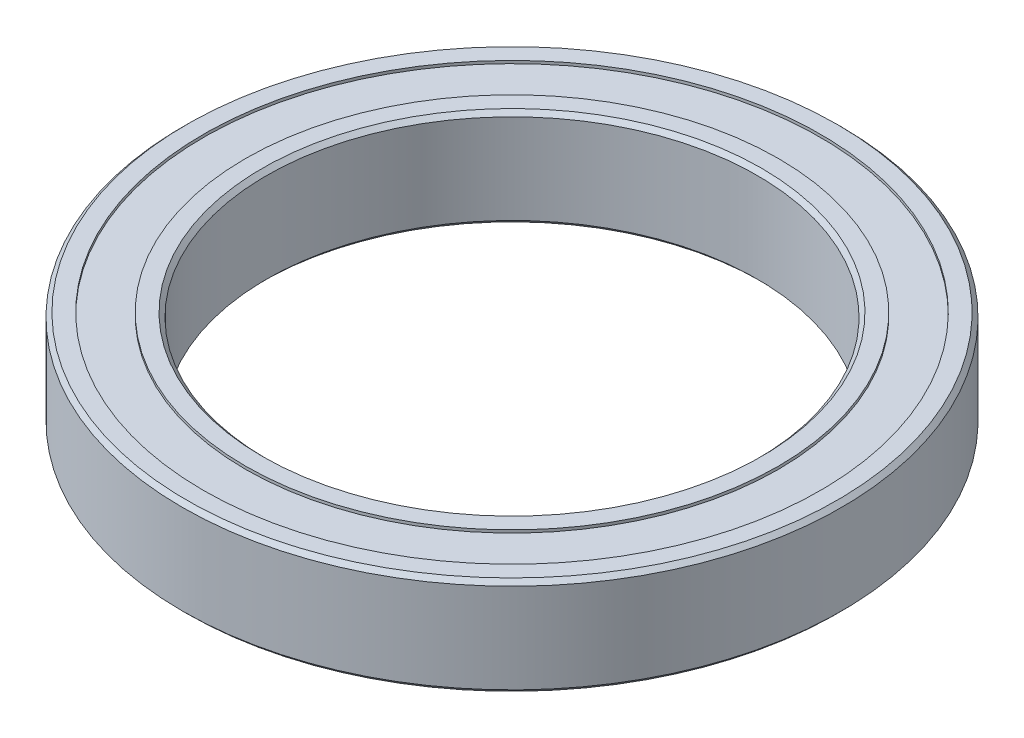
ISO-10303-21;
HEADER;
FILE_DESCRIPTION(('STEP AP214'),'2;1');
FILE_NAME('part.step','',(''),(''),'','','');
FILE_SCHEMA(('AUTOMOTIVE_DESIGN { 1 0 10303 214 1 1 1 1 }'));
ENDSEC;
DATA;
#1=APPLICATION_CONTEXT('core data for automotive mechanical design processes');
#2=APPLICATION_PROTOCOL_DEFINITION('international standard','automotive_design',2000,#1);
#3=PRODUCT_CONTEXT('',#1,'mechanical');
#4=PRODUCT('Part','Part','',(#3));
#5=PRODUCT_RELATED_PRODUCT_CATEGORY('part','',(#4));
#6=PRODUCT_DEFINITION_FORMATION('','',#4);
#7=PRODUCT_DEFINITION_CONTEXT('part definition',#1,'design');
#8=PRODUCT_DEFINITION('design','',#6,#7);
#9=PRODUCT_DEFINITION_SHAPE('','',#8);
#10=(LENGTH_UNIT() NAMED_UNIT(*) SI_UNIT(.MILLI.,.METRE.));
#11=(NAMED_UNIT(*) PLANE_ANGLE_UNIT() SI_UNIT($,.RADIAN.));
#12=(NAMED_UNIT(*) SI_UNIT($,.STERADIAN.) SOLID_ANGLE_UNIT());
#13=UNCERTAINTY_MEASURE_WITH_UNIT(LENGTH_MEASURE(1.E-05),#10,'distance_accuracy_value','');
#14=(GEOMETRIC_REPRESENTATION_CONTEXT(3) GLOBAL_UNCERTAINTY_ASSIGNED_CONTEXT((#13)) GLOBAL_UNIT_ASSIGNED_CONTEXT((#10,
#11,#12)) REPRESENTATION_CONTEXT('',''));
#15=CARTESIAN_POINT('',(0.,0.,0.));
#16=DIRECTION('',(0.,0.,1.));
#17=DIRECTION('',(1.,0.,0.));
#18=AXIS2_PLACEMENT_3D('',#15,#16,#17);
#19=CARTESIAN_POINT('',(0.,0.,0.));
#20=DIRECTION('',(0.,1.,0.));
#21=DIRECTION('',(0.,0.,1.));
#22=AXIS2_PLACEMENT_3D('',#19,#20,#21);
#23=PLANE('',#22);
#24=CARTESIAN_POINT('',(0.,0.,0.));
#25=DIRECTION('',(0.,1.,0.));
#26=DIRECTION('',(0.,0.,1.));
#27=AXIS2_PLACEMENT_3D('',#24,#25,#26);
#28=CIRCLE('',#27,17.8);
#29=CARTESIAN_POINT('',(0.,0.,17.8));
#30=VERTEX_POINT('',#29);
#31=EDGE_CURVE('E61',#30,#30,#28,.T.);
#32=ORIENTED_EDGE('',*,*,#31,.T.);
#33=EDGE_LOOP('',(#32));
#34=FACE_BOUND('',#33,.T.);
#35=CARTESIAN_POINT('',(0.,0.,0.));
#36=DIRECTION('',(0.,-1.,0.));
#37=DIRECTION('',(0.,0.,-1.));
#38=AXIS2_PLACEMENT_3D('',#35,#36,#37);
#39=CIRCLE('',#38,19.);
#40=CARTESIAN_POINT('',(0.,0.,-19.));
#41=VERTEX_POINT('',#40);
#42=EDGE_CURVE('E89',#41,#41,#39,.T.);
#43=ORIENTED_EDGE('',*,*,#42,.T.);
#44=EDGE_LOOP('',(#43));
#45=FACE_BOUND('',#44,.T.);
#46=ADVANCED_FACE('F37',(#34,#45),#23,.F.);
#47=CARTESIAN_POINT('',(0.,7.,0.));
#48=DIRECTION('',(0.,1.,0.));
#49=DIRECTION('',(0.,0.,1.));
#50=AXIS2_PLACEMENT_3D('',#47,#48,#49);
#51=PLANE('',#50);
#52=CARTESIAN_POINT('',(0.,7.,0.));
#53=DIRECTION('',(0.,1.,0.));
#54=DIRECTION('',(0.,0.,1.));
#55=AXIS2_PLACEMENT_3D('',#52,#53,#54);
#56=CIRCLE('',#55,17.8);
#57=CARTESIAN_POINT('',(0.,7.,17.8));
#58=VERTEX_POINT('',#57);
#59=EDGE_CURVE('E10',#58,#58,#56,.F.);
#60=ORIENTED_EDGE('',*,*,#59,.T.);
#61=EDGE_LOOP('',(#60));
#62=FACE_BOUND('',#61,.T.);
#63=CARTESIAN_POINT('',(0.,7.,0.));
#64=DIRECTION('',(0.,1.,0.));
#65=DIRECTION('',(0.,0.,1.));
#66=AXIS2_PLACEMENT_3D('',#63,#64,#65);
#67=CIRCLE('',#66,19.);
#68=CARTESIAN_POINT('',(0.,7.,19.));
#69=VERTEX_POINT('',#68);
#70=EDGE_CURVE('E77',#69,#69,#67,.T.);
#71=ORIENTED_EDGE('',*,*,#70,.T.);
#72=EDGE_LOOP('',(#71));
#73=FACE_BOUND('',#72,.T.);
#74=ADVANCED_FACE('F140',(#62,#73),#51,.T.);
#75=CARTESIAN_POINT('',(0.,7.,0.));
#76=DIRECTION('',(0.,1.,0.));
#77=DIRECTION('',(0.,0.,1.));
#78=AXIS2_PLACEMENT_3D('',#75,#76,#77);
#79=CIRCLE('',#78,23.2);
#80=CARTESIAN_POINT('',(0.,7.,-23.2));
#81=VERTEX_POINT('',#80);
#82=EDGE_CURVE('E53',#81,#81,#79,.T.);
#83=ORIENTED_EDGE('',*,*,#82,.T.);
#84=EDGE_LOOP('',(#83));
#85=FACE_BOUND('',#84,.T.);
#86=CARTESIAN_POINT('',(0.,7.,0.));
#87=DIRECTION('',(0.,1.,0.));
#88=DIRECTION('',(0.,0.,1.));
#89=AXIS2_PLACEMENT_3D('',#86,#87,#88);
#90=CIRCLE('',#89,22.);
#91=CARTESIAN_POINT('',(0.,7.,22.));
#92=VERTEX_POINT('',#91);
#93=EDGE_CURVE('E71',#92,#92,#90,.T.);
#94=ORIENTED_EDGE('',*,*,#93,.F.);
#95=EDGE_LOOP('',(#94));
#96=FACE_BOUND('',#95,.T.);
#97=ADVANCED_FACE('F114',(#85,#96),#51,.T.);
#98=CARTESIAN_POINT('',(0.,0.,0.));
#99=DIRECTION('',(0.,-1.,0.));
#100=DIRECTION('',(0.,0.,-1.));
#101=AXIS2_PLACEMENT_3D('',#98,#99,#100);
#102=CIRCLE('',#101,22.);
#103=CARTESIAN_POINT('',(0.,0.,-22.));
#104=VERTEX_POINT('',#103);
#105=EDGE_CURVE('E83',#104,#104,#102,.T.);
#106=ORIENTED_EDGE('',*,*,#105,.F.);
#107=EDGE_LOOP('',(#106));
#108=FACE_BOUND('',#107,.T.);
#109=CARTESIAN_POINT('',(0.,0.,0.));
#110=DIRECTION('',(0.,1.,0.));
#111=DIRECTION('',(0.,0.,1.));
#112=AXIS2_PLACEMENT_3D('',#109,#110,#111);
#113=CIRCLE('',#112,23.2);
#114=CARTESIAN_POINT('',(0.,0.,23.2));
#115=VERTEX_POINT('',#114);
#116=EDGE_CURVE('E58',#115,#115,#113,.F.);
#117=ORIENTED_EDGE('',*,*,#116,.T.);
#118=EDGE_LOOP('',(#117));
#119=FACE_BOUND('',#118,.T.);
#120=ADVANCED_FACE('F110',(#108,#119),#23,.F.);
#121=CARTESIAN_POINT('',(0.,7.,0.));
#122=DIRECTION('',(0.,-1.,0.));
#123=DIRECTION('',(0.,0.,-1.));
#124=AXIS2_PLACEMENT_3D('',#121,#122,#123);
#125=CYLINDRICAL_SURFACE('',#124,23.5);
#126=CARTESIAN_POINT('',(0.,0.300000000000002,0.));
#127=DIRECTION('',(0.,1.,0.));
#128=DIRECTION('',(0.,0.,1.));
#129=AXIS2_PLACEMENT_3D('',#126,#127,#128);
#130=CIRCLE('',#129,23.5);
#131=CARTESIAN_POINT('',(0.,0.300000000000002,23.5));
#132=VERTEX_POINT('',#131);
#133=EDGE_CURVE('E64',#132,#132,#130,.T.);
#134=ORIENTED_EDGE('',*,*,#133,.T.);
#135=EDGE_LOOP('',(#134));
#136=FACE_BOUND('',#135,.T.);
#137=CARTESIAN_POINT('',(0.,6.69999999999999,0.));
#138=DIRECTION('',(0.,1.,0.));
#139=DIRECTION('',(0.,0.,1.));
#140=AXIS2_PLACEMENT_3D('',#137,#138,#139);
#141=CIRCLE('',#140,23.5);
#142=CARTESIAN_POINT('',(0.,6.69999999999999,-23.5));
#143=VERTEX_POINT('',#142);
#144=EDGE_CURVE('E67',#143,#143,#141,.F.);
#145=ORIENTED_EDGE('',*,*,#144,.T.);
#146=EDGE_LOOP('',(#145));
#147=FACE_BOUND('',#146,.T.);
#148=ADVANCED_FACE('F113',(#136,#147),#125,.T.);
#149=CARTESIAN_POINT('',(0.,7.,0.));
#150=DIRECTION('',(0.,-1.,0.));
#151=DIRECTION('',(0.,0.,-1.));
#152=AXIS2_PLACEMENT_3D('',#149,#150,#151);
#153=CYLINDRICAL_SURFACE('',#152,17.5);
#154=CARTESIAN_POINT('',(0.,0.299999999999998,0.));
#155=DIRECTION('',(0.,1.,0.));
#156=DIRECTION('',(0.,0.,1.));
#157=AXIS2_PLACEMENT_3D('',#154,#155,#156);
#158=CIRCLE('',#157,17.5);
#159=CARTESIAN_POINT('',(0.,0.299999999999998,17.5));
#160=VERTEX_POINT('',#159);
#161=EDGE_CURVE('E45',#160,#160,#158,.F.);
#162=ORIENTED_EDGE('',*,*,#161,.T.);
#163=EDGE_LOOP('',(#162));
#164=FACE_BOUND('',#163,.T.);
#165=CARTESIAN_POINT('',(0.,6.70000000000001,0.));
#166=DIRECTION('',(0.,1.,0.));
#167=DIRECTION('',(0.,0.,1.));
#168=AXIS2_PLACEMENT_3D('',#165,#166,#167);
#169=CIRCLE('',#168,17.5);
#170=CARTESIAN_POINT('',(0.,6.70000000000001,17.5));
#171=VERTEX_POINT('',#170);
#172=EDGE_CURVE('E49',#171,#171,#169,.T.);
#173=ORIENTED_EDGE('',*,*,#172,.T.);
#174=EDGE_LOOP('',(#173));
#175=FACE_BOUND('',#174,.T.);
#176=ADVANCED_FACE('F128',(#164,#175),#153,.F.);
#177=CARTESIAN_POINT('',(0.,6.8,0.));
#178=DIRECTION('',(0.,1.,0.));
#179=DIRECTION('',(0.,0.,1.));
#180=AXIS2_PLACEMENT_3D('',#177,#178,#179);
#181=CYLINDRICAL_SURFACE('',#180,22.);
#182=CARTESIAN_POINT('',(0.,6.8,0.));
#183=DIRECTION('',(0.,1.,0.));
#184=DIRECTION('',(0.,0.,1.));
#185=AXIS2_PLACEMENT_3D('',#182,#183,#184);
#186=CIRCLE('',#185,22.);
#187=CARTESIAN_POINT('',(0.,6.8,22.));
#188=VERTEX_POINT('',#187);
#189=EDGE_CURVE('E70',#188,#188,#186,.T.);
#190=ORIENTED_EDGE('',*,*,#189,.F.);
#191=EDGE_LOOP('',(#190));
#192=FACE_BOUND('',#191,.T.);
#193=ORIENTED_EDGE('',*,*,#93,.T.);
#194=EDGE_LOOP('',(#193));
#195=FACE_BOUND('',#194,.T.);
#196=ADVANCED_FACE('F144',(#192,#195),#181,.F.);
#197=CARTESIAN_POINT('',(0.,6.8,0.));
#198=DIRECTION('',(0.,1.,0.));
#199=DIRECTION('',(0.,0.,1.));
#200=AXIS2_PLACEMENT_3D('',#197,#198,#199);
#201=PLANE('',#200);
#202=CARTESIAN_POINT('',(0.,6.8,0.));
#203=DIRECTION('',(0.,1.,0.));
#204=DIRECTION('',(0.,0.,1.));
#205=AXIS2_PLACEMENT_3D('',#202,#203,#204);
#206=CIRCLE('',#205,19.);
#207=CARTESIAN_POINT('',(0.,6.8,19.));
#208=VERTEX_POINT('',#207);
#209=EDGE_CURVE('E74',#208,#208,#206,.T.);
#210=ORIENTED_EDGE('',*,*,#209,.F.);
#211=EDGE_LOOP('',(#210));
#212=FACE_BOUND('',#211,.T.);
#213=ORIENTED_EDGE('',*,*,#189,.T.);
#214=EDGE_LOOP('',(#213));
#215=FACE_BOUND('',#214,.T.);
#216=ADVANCED_FACE('F146',(#212,#215),#201,.T.);
#217=CARTESIAN_POINT('',(0.,6.8,0.));
#218=DIRECTION('',(0.,1.,0.));
#219=DIRECTION('',(0.,0.,1.));
#220=AXIS2_PLACEMENT_3D('',#217,#218,#219);
#221=CYLINDRICAL_SURFACE('',#220,19.);
#222=ORIENTED_EDGE('',*,*,#209,.T.);
#223=EDGE_LOOP('',(#222));
#224=FACE_BOUND('',#223,.T.);
#225=ORIENTED_EDGE('',*,*,#70,.F.);
#226=EDGE_LOOP('',(#225));
#227=FACE_BOUND('',#226,.T.);
#228=ADVANCED_FACE('F122',(#224,#227),#221,.T.);
#229=CARTESIAN_POINT('',(0.,0.300000000000002,0.));
#230=DIRECTION('',(0.,1.,0.));
#231=DIRECTION('',(0.,0.,1.));
#232=AXIS2_PLACEMENT_3D('',#229,#230,#231);
#233=CONICAL_SURFACE('',#232,23.5,0.785398163397448);
#234=ORIENTED_EDGE('',*,*,#116,.F.);
#235=EDGE_LOOP('',(#234));
#236=FACE_BOUND('',#235,.T.);
#237=ORIENTED_EDGE('',*,*,#133,.F.);
#238=EDGE_LOOP('',(#237));
#239=FACE_BOUND('',#238,.T.);
#240=ADVANCED_FACE('F118',(#236,#239),#233,.T.);
#241=CARTESIAN_POINT('',(0.,7.,0.));
#242=DIRECTION('',(0.,-1.,0.));
#243=DIRECTION('',(0.,0.,-1.));
#244=AXIS2_PLACEMENT_3D('',#241,#242,#243);
#245=CONICAL_SURFACE('',#244,23.2,0.785398163397448);
#246=CARTESIAN_POINT('',(0.,6.69999999999999,-23.5));
#247=CARTESIAN_POINT('',(0.,6.703125,-23.496875));
#248=CARTESIAN_POINT('',(0.,6.70625,-23.49375));
#249=CARTESIAN_POINT('',(0.,6.71249999999999,-23.4875));
#250=CARTESIAN_POINT('',(0.,6.71562499999999,-23.484375));
#251=CARTESIAN_POINT('',(0.,6.72187499999999,-23.478125));
#252=CARTESIAN_POINT('',(0.,6.725,-23.475));
#253=CARTESIAN_POINT('',(0.,6.73125,-23.46875));
#254=CARTESIAN_POINT('',(0.,6.734375,-23.465625));
#255=CARTESIAN_POINT('',(0.,6.740625,-23.459375));
#256=CARTESIAN_POINT('',(0.,6.74374999999999,-23.45625));
#257=CARTESIAN_POINT('',(0.,6.74999999999999,-23.45));
#258=CARTESIAN_POINT('',(0.,6.753125,-23.446875));
#259=CARTESIAN_POINT('',(0.,6.759375,-23.440625));
#260=CARTESIAN_POINT('',(0.,6.7625,-23.4375));
#261=CARTESIAN_POINT('',(0.,6.76875,-23.43125));
#262=CARTESIAN_POINT('',(0.,6.771875,-23.428125));
#263=CARTESIAN_POINT('',(0.,6.778125,-23.421875));
#264=CARTESIAN_POINT('',(0.,6.78125,-23.41875));
#265=CARTESIAN_POINT('',(0.,6.7875,-23.4125));
#266=CARTESIAN_POINT('',(0.,6.790625,-23.409375));
#267=CARTESIAN_POINT('',(0.,6.796875,-23.403125));
#268=CARTESIAN_POINT('',(0.,6.8,-23.4));
#269=CARTESIAN_POINT('',(0.,6.80625,-23.39375));
#270=CARTESIAN_POINT('',(0.,6.809375,-23.390625));
#271=CARTESIAN_POINT('',(0.,6.815625,-23.384375));
#272=CARTESIAN_POINT('',(0.,6.81875,-23.38125));
#273=CARTESIAN_POINT('',(0.,6.825,-23.375));
#274=CARTESIAN_POINT('',(0.,6.828125,-23.371875));
#275=CARTESIAN_POINT('',(0.,6.834375,-23.365625));
#276=CARTESIAN_POINT('',(0.,6.8375,-23.3625));
#277=CARTESIAN_POINT('',(0.,6.84375,-23.35625));
#278=CARTESIAN_POINT('',(0.,6.846875,-23.353125));
#279=CARTESIAN_POINT('',(0.,6.853125,-23.346875));
#280=CARTESIAN_POINT('',(0.,6.85625,-23.34375));
#281=CARTESIAN_POINT('',(0.,6.8625,-23.3375));
#282=CARTESIAN_POINT('',(0.,6.865625,-23.334375));
#283=CARTESIAN_POINT('',(0.,6.871875,-23.328125));
#284=CARTESIAN_POINT('',(0.,6.875,-23.325));
#285=CARTESIAN_POINT('',(0.,6.88125,-23.31875));
#286=CARTESIAN_POINT('',(0.,6.884375,-23.315625));
#287=CARTESIAN_POINT('',(0.,6.890625,-23.309375));
#288=CARTESIAN_POINT('',(0.,6.89375,-23.30625));
#289=CARTESIAN_POINT('',(0.,6.9,-23.3));
#290=CARTESIAN_POINT('',(0.,6.903125,-23.296875));
#291=CARTESIAN_POINT('',(0.,6.909375,-23.290625));
#292=CARTESIAN_POINT('',(0.,6.9125,-23.2875));
#293=CARTESIAN_POINT('',(0.,6.91875,-23.28125));
#294=CARTESIAN_POINT('',(0.,6.921875,-23.278125));
#295=CARTESIAN_POINT('',(0.,6.928125,-23.271875));
#296=CARTESIAN_POINT('',(0.,6.93125,-23.26875));
#297=CARTESIAN_POINT('',(0.,6.9375,-23.2625));
#298=CARTESIAN_POINT('',(0.,6.940625,-23.259375));
#299=CARTESIAN_POINT('',(0.,6.946875,-23.253125));
#300=CARTESIAN_POINT('',(0.,6.95,-23.25));
#301=CARTESIAN_POINT('',(0.,6.95625,-23.24375));
#302=CARTESIAN_POINT('',(0.,6.959375,-23.240625));
#303=CARTESIAN_POINT('',(0.,6.965625,-23.234375));
#304=CARTESIAN_POINT('',(0.,6.96875,-23.23125));
#305=CARTESIAN_POINT('',(0.,6.975,-23.225));
#306=CARTESIAN_POINT('',(0.,6.978125,-23.221875));
#307=CARTESIAN_POINT('',(0.,6.984375,-23.215625));
#308=CARTESIAN_POINT('',(0.,6.9875,-23.2125));
#309=CARTESIAN_POINT('',(0.,6.99375,-23.20625));
#310=CARTESIAN_POINT('',(0.,6.996875,-23.203125));
#311=CARTESIAN_POINT('',(0.,7.,-23.2));
#312=B_SPLINE_CURVE_WITH_KNOTS('',3,(#246,#247,#248,#249,#250,#251,#252,#253,#254,#255,#256,
#257,#258,#259,#260,#261,#262,#263,#264,#265,#266,#267,#268,#269,#270,#271,#272,#273,#274,#275,
#276,#277,#278,#279,#280,#281,#282,#283,#284,#285,#286,#287,#288,#289,#290,#291,#292,#293,#294,
#295,#296,#297,#298,#299,#300,#301,#302,#303,#304,#305,#306,#307,#308,#309,#310,#311),
.UNSPECIFIED.,.F.,.F.,(4,2,2,2,2,2,2,2,2,2,2,2,2,2,2,2,2,2,2,2,2,2,2,2,2,2,2,2,2,2,2,2,4),(0.,
0.0132582521472469,0.0265165042944963,0.0397747564417438,0.0530330085889907,0.0662912607362401,
0.0795495128834876,0.0928077650307346,0.106066017177985,0.119324269325231,0.132582521472478,
0.145840773619728,0.159099025766975,0.172357277914222,0.185615530061472,0.198873782208719,
0.212132034355967,0.225390286503216,0.238648538650463,0.25190679079771,0.26516504294496,
0.278423295092207,0.291681547239454,0.304939799386704,0.318198051533951,0.331456303681198,
0.344714555828447,0.357972807975695,0.371231060122942,0.384489312270191,0.397747564417439,
0.411005816564688,0.424264068711936),.UNSPECIFIED.);
#313=EDGE_CURVE('BSEAM121',#143,#81,#312,.T.);
#314=ORIENTED_EDGE('',*,*,#144,.F.);
#315=ORIENTED_EDGE('',*,*,#82,.F.);
#316=ORIENTED_EDGE('',*,*,#313,.T.);
#317=ORIENTED_EDGE('',*,*,#313,.F.);
#318=EDGE_LOOP('',(#314,#316,#315,#317));
#319=FACE_BOUND('',#318,.T.);
#320=ADVANCED_FACE('F121',(#319),#245,.T.);
#321=CARTESIAN_POINT('',(0.,0.,0.));
#322=DIRECTION('',(0.,-1.,0.));
#323=DIRECTION('',(0.,0.,-1.));
#324=AXIS2_PLACEMENT_3D('',#321,#322,#323);
#325=CONICAL_SURFACE('',#324,17.8,0.785398163397454);
#326=ORIENTED_EDGE('',*,*,#161,.F.);
#327=EDGE_LOOP('',(#326));
#328=FACE_BOUND('',#327,.T.);
#329=ORIENTED_EDGE('',*,*,#31,.F.);
#330=EDGE_LOOP('',(#329));
#331=FACE_BOUND('',#330,.T.);
#332=ADVANCED_FACE('F134',(#328,#331),#325,.F.);
#333=CARTESIAN_POINT('',(0.,6.70000000000001,0.));
#334=DIRECTION('',(0.,1.,0.));
#335=DIRECTION('',(0.,0.,1.));
#336=AXIS2_PLACEMENT_3D('',#333,#334,#335);
#337=CONICAL_SURFACE('',#336,17.5,0.785398163397466);
#338=ORIENTED_EDGE('',*,*,#59,.F.);
#339=EDGE_LOOP('',(#338));
#340=FACE_BOUND('',#339,.T.);
#341=ORIENTED_EDGE('',*,*,#172,.F.);
#342=EDGE_LOOP('',(#341));
#343=FACE_BOUND('',#342,.T.);
#344=ADVANCED_FACE('F40',(#340,#343),#337,.F.);
#345=CARTESIAN_POINT('',(0.,0.2,0.));
#346=DIRECTION('',(0.,-1.,0.));
#347=DIRECTION('',(0.,0.,-1.));
#348=AXIS2_PLACEMENT_3D('',#345,#346,#347);
#349=CYLINDRICAL_SURFACE('',#348,22.);
#350=CARTESIAN_POINT('',(0.,0.2,0.));
#351=DIRECTION('',(0.,-1.,0.));
#352=DIRECTION('',(0.,0.,-1.));
#353=AXIS2_PLACEMENT_3D('',#350,#351,#352);
#354=CIRCLE('',#353,22.);
#355=CARTESIAN_POINT('',(0.,0.2,-22.));
#356=VERTEX_POINT('',#355);
#357=EDGE_CURVE('E80',#356,#356,#354,.T.);
#358=ORIENTED_EDGE('',*,*,#357,.F.);
#359=EDGE_LOOP('',(#358));
#360=FACE_BOUND('',#359,.T.);
#361=ORIENTED_EDGE('',*,*,#105,.T.);
#362=EDGE_LOOP('',(#361));
#363=FACE_BOUND('',#362,.T.);
#364=ADVANCED_FACE('F101',(#360,#363),#349,.F.);
#365=CARTESIAN_POINT('',(0.,0.2,0.));
#366=DIRECTION('',(0.,-1.,0.));
#367=DIRECTION('',(0.,0.,-1.));
#368=AXIS2_PLACEMENT_3D('',#365,#366,#367);
#369=PLANE('',#368);
#370=CARTESIAN_POINT('',(0.,0.2,0.));
#371=DIRECTION('',(0.,-1.,0.));
#372=DIRECTION('',(0.,0.,-1.));
#373=AXIS2_PLACEMENT_3D('',#370,#371,#372);
#374=CIRCLE('',#373,19.);
#375=CARTESIAN_POINT('',(0.,0.2,-19.));
#376=VERTEX_POINT('',#375);
#377=EDGE_CURVE('E86',#376,#376,#374,.T.);
#378=ORIENTED_EDGE('',*,*,#377,.F.);
#379=EDGE_LOOP('',(#378));
#380=FACE_BOUND('',#379,.T.);
#381=ORIENTED_EDGE('',*,*,#357,.T.);
#382=EDGE_LOOP('',(#381));
#383=FACE_BOUND('',#382,.T.);
#384=ADVANCED_FACE('F98',(#380,#383),#369,.T.);
#385=CARTESIAN_POINT('',(0.,0.2,0.));
#386=DIRECTION('',(0.,-1.,0.));
#387=DIRECTION('',(0.,0.,-1.));
#388=AXIS2_PLACEMENT_3D('',#385,#386,#387);
#389=CYLINDRICAL_SURFACE('',#388,19.);
#390=ORIENTED_EDGE('',*,*,#377,.T.);
#391=EDGE_LOOP('',(#390));
#392=FACE_BOUND('',#391,.T.);
#393=ORIENTED_EDGE('',*,*,#42,.F.);
#394=EDGE_LOOP('',(#393));
#395=FACE_BOUND('',#394,.T.);
#396=ADVANCED_FACE('F95',(#392,#395),#389,.T.);
#397=CLOSED_SHELL('',(#46,#74,#97,#120,#148,#176,#196,#216,#228,#240,#320,#332,#344,#364,#384,#396));
#398=MANIFOLD_SOLID_BREP('B2',#397);
#399=ADVANCED_BREP_SHAPE_REPRESENTATION('',(#18,#398),#14);
#400=SHAPE_DEFINITION_REPRESENTATION(#9,#399);
ENDSEC;
END-ISO-10303-21;
